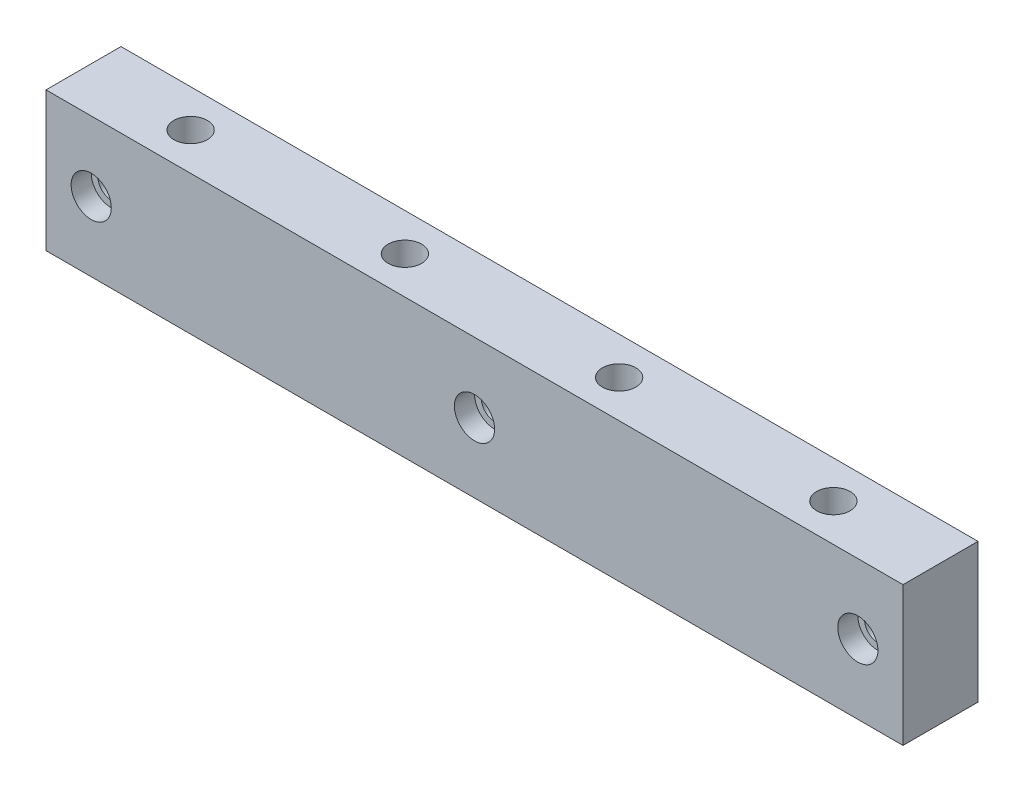
ISO-10303-21;
HEADER;
FILE_DESCRIPTION(('STEP AP214'),'2;1');
FILE_NAME('part.step','',(''),(''),'','','');
FILE_SCHEMA(('AUTOMOTIVE_DESIGN { 1 0 10303 214 1 1 1 1 }'));
ENDSEC;
DATA;
#1=APPLICATION_CONTEXT('core data for automotive mechanical design processes');
#2=APPLICATION_PROTOCOL_DEFINITION('international standard','automotive_design',2000,#1);
#3=PRODUCT_CONTEXT('',#1,'mechanical');
#4=PRODUCT('Part','Part','',(#3));
#5=PRODUCT_RELATED_PRODUCT_CATEGORY('part','',(#4));
#6=PRODUCT_DEFINITION_FORMATION('','',#4);
#7=PRODUCT_DEFINITION_CONTEXT('part definition',#1,'design');
#8=PRODUCT_DEFINITION('design','',#6,#7);
#9=PRODUCT_DEFINITION_SHAPE('','',#8);
#10=(LENGTH_UNIT() NAMED_UNIT(*) SI_UNIT(.MILLI.,.METRE.));
#11=(NAMED_UNIT(*) PLANE_ANGLE_UNIT() SI_UNIT($,.RADIAN.));
#12=(NAMED_UNIT(*) SI_UNIT($,.STERADIAN.) SOLID_ANGLE_UNIT());
#13=UNCERTAINTY_MEASURE_WITH_UNIT(LENGTH_MEASURE(1.E-05),#10,'distance_accuracy_value','');
#14=(GEOMETRIC_REPRESENTATION_CONTEXT(3) GLOBAL_UNCERTAINTY_ASSIGNED_CONTEXT((#13)) GLOBAL_UNIT_ASSIGNED_CONTEXT((#10,
#11,#12)) REPRESENTATION_CONTEXT('',''));
#15=CARTESIAN_POINT('',(0.,0.,0.));
#16=DIRECTION('',(0.,0.,1.));
#17=DIRECTION('',(1.,0.,0.));
#18=AXIS2_PLACEMENT_3D('',#15,#16,#17);
#19=CARTESIAN_POINT('',(-90.884375,-16.51,-26.7602561210691));
#20=DIRECTION('',(0.,0.,1.));
#21=DIRECTION('',(1.,0.,0.));
#22=AXIS2_PLACEMENT_3D('',#19,#20,#21);
#23=CYLINDRICAL_SURFACE('',#22,3.175);
#24=CARTESIAN_POINT('',(-90.884375,-16.51,-17.78));
#25=DIRECTION('',(0.,0.,-1.));
#26=DIRECTION('',(-1.,0.,0.));
#27=AXIS2_PLACEMENT_3D('',#24,#25,#26);
#28=CIRCLE('',#27,3.175);
#29=CARTESIAN_POINT('',(-94.059375,-16.51,-17.78));
#30=VERTEX_POINT('',#29);
#31=EDGE_CURVE('E125',#30,#30,#28,.F.);
#32=ORIENTED_EDGE('',*,*,#31,.F.);
#33=EDGE_LOOP('',(#32));
#34=FACE_BOUND('',#33,.T.);
#35=CARTESIAN_POINT('',(-90.884375,-16.51,-4.7752));
#36=DIRECTION('',(0.,0.,1.));
#37=DIRECTION('',(1.,0.,0.));
#38=AXIS2_PLACEMENT_3D('',#35,#36,#37);
#39=CIRCLE('',#38,3.175);
#40=CARTESIAN_POINT('',(-87.709375,-16.51,-4.7752));
#41=VERTEX_POINT('',#40);
#42=EDGE_CURVE('E42',#41,#41,#39,.F.);
#43=ORIENTED_EDGE('',*,*,#42,.F.);
#44=EDGE_LOOP('',(#43));
#45=FACE_BOUND('',#44,.T.);
#46=ADVANCED_FACE('F38',(#34,#45),#23,.F.);
#47=CARTESIAN_POINT('',(0.,-16.51,-26.7602561210691));
#48=DIRECTION('',(0.,0.,1.));
#49=DIRECTION('',(1.,0.,0.));
#50=AXIS2_PLACEMENT_3D('',#47,#48,#49);
#51=CYLINDRICAL_SURFACE('',#50,3.175);
#52=CARTESIAN_POINT('',(0.,-16.51,-17.78));
#53=DIRECTION('',(0.,0.,-1.));
#54=DIRECTION('',(-1.,0.,0.));
#55=AXIS2_PLACEMENT_3D('',#52,#53,#54);
#56=CIRCLE('',#55,3.175);
#57=CARTESIAN_POINT('',(-3.175,-16.51,-17.78));
#58=VERTEX_POINT('',#57);
#59=EDGE_CURVE('E129',#58,#58,#56,.F.);
#60=ORIENTED_EDGE('',*,*,#59,.F.);
#61=EDGE_LOOP('',(#60));
#62=FACE_BOUND('',#61,.T.);
#63=CARTESIAN_POINT('',(0.,-16.51,-4.7752));
#64=DIRECTION('',(0.,0.,1.));
#65=DIRECTION('',(1.,0.,0.));
#66=AXIS2_PLACEMENT_3D('',#63,#64,#65);
#67=CIRCLE('',#66,3.175);
#68=CARTESIAN_POINT('',(3.175,-16.51,-4.7752));
#69=VERTEX_POINT('',#68);
#70=EDGE_CURVE('E119',#69,#69,#67,.F.);
#71=ORIENTED_EDGE('',*,*,#70,.F.);
#72=EDGE_LOOP('',(#71));
#73=FACE_BOUND('',#72,.T.);
#74=ADVANCED_FACE('F181',(#62,#73),#51,.F.);
#75=CARTESIAN_POINT('',(90.884375,-16.51,-26.7602561210691));
#76=DIRECTION('',(0.,0.,1.));
#77=DIRECTION('',(1.,0.,0.));
#78=AXIS2_PLACEMENT_3D('',#75,#76,#77);
#79=CYLINDRICAL_SURFACE('',#78,3.175);
#80=CARTESIAN_POINT('',(90.884375,-16.51,-17.78));
#81=DIRECTION('',(0.,0.,-1.));
#82=DIRECTION('',(-1.,0.,0.));
#83=AXIS2_PLACEMENT_3D('',#80,#81,#82);
#84=CIRCLE('',#83,3.175);
#85=CARTESIAN_POINT('',(87.709375,-16.51,-17.78));
#86=VERTEX_POINT('',#85);
#87=EDGE_CURVE('E134',#86,#86,#84,.F.);
#88=ORIENTED_EDGE('',*,*,#87,.F.);
#89=EDGE_LOOP('',(#88));
#90=FACE_BOUND('',#89,.T.);
#91=CARTESIAN_POINT('',(90.884375,-16.51,-4.7752));
#92=DIRECTION('',(0.,0.,1.));
#93=DIRECTION('',(1.,0.,0.));
#94=AXIS2_PLACEMENT_3D('',#91,#92,#93);
#95=CIRCLE('',#94,3.175);
#96=CARTESIAN_POINT('',(94.059375,-16.51,-4.7752));
#97=VERTEX_POINT('',#96);
#98=EDGE_CURVE('E117',#97,#97,#95,.F.);
#99=ORIENTED_EDGE('',*,*,#98,.F.);
#100=EDGE_LOOP('',(#99));
#101=FACE_BOUND('',#100,.T.);
#102=ADVANCED_FACE('F177',(#90,#101),#79,.F.);
#103=CARTESIAN_POINT('',(-101.6,-33.02,-17.78));
#104=DIRECTION('',(-1.,0.,0.));
#105=DIRECTION('',(0.,0.,1.));
#106=AXIS2_PLACEMENT_3D('',#103,#104,#105);
#107=PLANE('',#106);
#108=DIRECTION('',(0.,0.,1.));
#109=VECTOR('',#108,1.);
#110=CARTESIAN_POINT('',(-101.6,0.,-17.78));
#111=LINE('',#110,#109);
#112=CARTESIAN_POINT('',(-101.6,0.,-17.78));
#113=VERTEX_POINT('',#112);
#114=CARTESIAN_POINT('',(-101.6,0.,0.));
#115=VERTEX_POINT('',#114);
#116=EDGE_CURVE('E106',#113,#115,#111,.T.);
#117=ORIENTED_EDGE('',*,*,#116,.F.);
#118=DIRECTION('',(0.,1.,0.));
#119=VECTOR('',#118,1.);
#120=CARTESIAN_POINT('',(-101.6,-33.02,-17.78));
#121=LINE('',#120,#119);
#122=CARTESIAN_POINT('',(-101.6,-33.02,-17.78));
#123=VERTEX_POINT('',#122);
#124=EDGE_CURVE('E11',#123,#113,#121,.T.);
#125=ORIENTED_EDGE('',*,*,#124,.F.);
#126=DIRECTION('',(0.,0.,1.));
#127=VECTOR('',#126,1.);
#128=CARTESIAN_POINT('',(-101.6,-33.02,-17.78));
#129=LINE('',#128,#127);
#130=CARTESIAN_POINT('',(-101.6,-33.02,0.));
#131=VERTEX_POINT('',#130);
#132=EDGE_CURVE('E99',#123,#131,#129,.T.);
#133=ORIENTED_EDGE('',*,*,#132,.T.);
#134=DIRECTION('',(0.,1.,0.));
#135=VECTOR('',#134,1.);
#136=CARTESIAN_POINT('',(-101.6,-33.02,0.));
#137=LINE('',#136,#135);
#138=EDGE_CURVE('E82',#131,#115,#137,.T.);
#139=ORIENTED_EDGE('',*,*,#138,.T.);
#140=EDGE_LOOP('',(#117,#125,#133,#139));
#141=FACE_BOUND('',#140,.T.);
#142=ADVANCED_FACE('F40',(#141),#107,.T.);
#143=CARTESIAN_POINT('',(101.6,-33.02,-17.78));
#144=DIRECTION('',(0.,0.,-1.));
#145=DIRECTION('',(-1.,0.,0.));
#146=AXIS2_PLACEMENT_3D('',#143,#144,#145);
#147=PLANE('',#146);
#148=ORIENTED_EDGE('',*,*,#87,.T.);
#149=EDGE_LOOP('',(#148));
#150=FACE_BOUND('',#149,.T.);
#151=ORIENTED_EDGE('',*,*,#59,.T.);
#152=EDGE_LOOP('',(#151));
#153=FACE_BOUND('',#152,.T.);
#154=ORIENTED_EDGE('',*,*,#31,.T.);
#155=EDGE_LOOP('',(#154));
#156=FACE_BOUND('',#155,.T.);
#157=DIRECTION('',(-1.,0.,0.));
#158=VECTOR('',#157,1.);
#159=CARTESIAN_POINT('',(101.6,0.,-17.78));
#160=LINE('',#159,#158);
#161=CARTESIAN_POINT('',(101.6,0.,-17.78));
#162=VERTEX_POINT('',#161);
#163=EDGE_CURVE('E101',#162,#113,#160,.T.);
#164=ORIENTED_EDGE('',*,*,#163,.F.);
#165=DIRECTION('',(0.,1.,0.));
#166=VECTOR('',#165,1.);
#167=CARTESIAN_POINT('',(101.6,-33.02,-17.78));
#168=LINE('',#167,#166);
#169=CARTESIAN_POINT('',(101.6,-33.02,-17.78));
#170=VERTEX_POINT('',#169);
#171=EDGE_CURVE('E48',#170,#162,#168,.T.);
#172=ORIENTED_EDGE('',*,*,#171,.F.);
#173=DIRECTION('',(-1.,0.,0.));
#174=VECTOR('',#173,1.);
#175=CARTESIAN_POINT('',(101.6,-33.02,-17.78));
#176=LINE('',#175,#174);
#177=EDGE_CURVE('E96',#170,#123,#176,.T.);
#178=ORIENTED_EDGE('',*,*,#177,.T.);
#179=ORIENTED_EDGE('',*,*,#124,.T.);
#180=EDGE_LOOP('',(#164,#172,#178,#179));
#181=FACE_BOUND('',#180,.T.);
#182=ADVANCED_FACE('F168',(#150,#153,#156,#181),#147,.T.);
#183=CARTESIAN_POINT('',(101.6,-33.02,-17.78));
#184=DIRECTION('',(1.,0.,0.));
#185=DIRECTION('',(0.,0.,-1.));
#186=AXIS2_PLACEMENT_3D('',#183,#184,#185);
#187=PLANE('',#186);
#188=DIRECTION('',(0.,0.,-1.));
#189=VECTOR('',#188,1.);
#190=CARTESIAN_POINT('',(101.6,0.,-17.78));
#191=LINE('',#190,#189);
#192=CARTESIAN_POINT('',(101.6,0.,0.));
#193=VERTEX_POINT('',#192);
#194=EDGE_CURVE('E90',#193,#162,#191,.T.);
#195=ORIENTED_EDGE('',*,*,#194,.F.);
#196=DIRECTION('',(0.,1.,0.));
#197=VECTOR('',#196,1.);
#198=CARTESIAN_POINT('',(101.6,-33.02,0.));
#199=LINE('',#198,#197);
#200=CARTESIAN_POINT('',(101.6,-33.02,0.));
#201=VERTEX_POINT('',#200);
#202=EDGE_CURVE('E85',#201,#193,#199,.T.);
#203=ORIENTED_EDGE('',*,*,#202,.F.);
#204=DIRECTION('',(0.,0.,-1.));
#205=VECTOR('',#204,1.);
#206=CARTESIAN_POINT('',(101.6,-33.02,-17.78));
#207=LINE('',#206,#205);
#208=EDGE_CURVE('E88',#201,#170,#207,.T.);
#209=ORIENTED_EDGE('',*,*,#208,.T.);
#210=ORIENTED_EDGE('',*,*,#171,.T.);
#211=EDGE_LOOP('',(#195,#203,#209,#210));
#212=FACE_BOUND('',#211,.T.);
#213=ADVANCED_FACE('F87',(#212),#187,.T.);
#214=CARTESIAN_POINT('',(101.6,-33.02,0.));
#215=DIRECTION('',(0.,0.,1.));
#216=DIRECTION('',(1.,0.,0.));
#217=AXIS2_PLACEMENT_3D('',#214,#215,#216);
#218=PLANE('',#217);
#219=CARTESIAN_POINT('',(90.884375,-16.51,0.));
#220=DIRECTION('',(0.,0.,1.));
#221=DIRECTION('',(1.,0.,0.));
#222=AXIS2_PLACEMENT_3D('',#219,#220,#221);
#223=CIRCLE('',#222,4.76250000000001);
#224=CARTESIAN_POINT('',(95.646875,-16.51,0.));
#225=VERTEX_POINT('',#224);
#226=EDGE_CURVE('E234',#225,#225,#223,.T.);
#227=ORIENTED_EDGE('',*,*,#226,.F.);
#228=EDGE_LOOP('',(#227));
#229=FACE_BOUND('',#228,.T.);
#230=CARTESIAN_POINT('',(0.,-16.51,0.));
#231=DIRECTION('',(0.,0.,1.));
#232=DIRECTION('',(1.,0.,0.));
#233=AXIS2_PLACEMENT_3D('',#230,#231,#232);
#234=CIRCLE('',#233,4.7625);
#235=CARTESIAN_POINT('',(4.7625,-16.51,0.));
#236=VERTEX_POINT('',#235);
#237=EDGE_CURVE('E238',#236,#236,#234,.T.);
#238=ORIENTED_EDGE('',*,*,#237,.F.);
#239=EDGE_LOOP('',(#238));
#240=FACE_BOUND('',#239,.T.);
#241=CARTESIAN_POINT('',(-90.884375,-16.51,0.));
#242=DIRECTION('',(0.,0.,1.));
#243=DIRECTION('',(1.,0.,0.));
#244=AXIS2_PLACEMENT_3D('',#241,#242,#243);
#245=CIRCLE('',#244,4.7625);
#246=CARTESIAN_POINT('',(-86.121875,-16.51,0.));
#247=VERTEX_POINT('',#246);
#248=EDGE_CURVE('E241',#247,#247,#245,.T.);
#249=ORIENTED_EDGE('',*,*,#248,.F.);
#250=EDGE_LOOP('',(#249));
#251=FACE_BOUND('',#250,.T.);
#252=DIRECTION('',(1.,0.,0.));
#253=VECTOR('',#252,1.);
#254=CARTESIAN_POINT('',(101.6,0.,0.));
#255=LINE('',#254,#253);
#256=EDGE_CURVE('E109',#115,#193,#255,.T.);
#257=ORIENTED_EDGE('',*,*,#256,.F.);
#258=ORIENTED_EDGE('',*,*,#138,.F.);
#259=DIRECTION('',(1.,0.,0.));
#260=VECTOR('',#259,1.);
#261=CARTESIAN_POINT('',(101.6,-33.02,0.));
#262=LINE('',#261,#260);
#263=EDGE_CURVE('E95',#131,#201,#262,.T.);
#264=ORIENTED_EDGE('',*,*,#263,.T.);
#265=ORIENTED_EDGE('',*,*,#202,.T.);
#266=EDGE_LOOP('',(#257,#258,#264,#265));
#267=FACE_BOUND('',#266,.T.);
#268=ADVANCED_FACE('F98',(#229,#240,#251,#267),#218,.T.);
#269=CARTESIAN_POINT('',(0.,-33.02,0.));
#270=DIRECTION('',(0.,-1.,0.));
#271=DIRECTION('',(0.,0.,-1.));
#272=AXIS2_PLACEMENT_3D('',#269,#270,#271);
#273=PLANE('',#272);
#274=CARTESIAN_POINT('',(-76.2,-33.02,-8.88999999999998));
#275=DIRECTION('',(0.,1.,0.));
#276=DIRECTION('',(0.,0.,1.));
#277=AXIS2_PLACEMENT_3D('',#274,#275,#276);
#278=CIRCLE('',#277,3.96875);
#279=CARTESIAN_POINT('',(-76.2,-33.02,-4.92124999999998));
#280=VERTEX_POINT('',#279);
#281=EDGE_CURVE('E138',#280,#280,#278,.T.);
#282=ORIENTED_EDGE('',*,*,#281,.T.);
#283=EDGE_LOOP('',(#282));
#284=FACE_BOUND('',#283,.T.);
#285=CARTESIAN_POINT('',(-25.4,-33.02,-8.88999999999998));
#286=DIRECTION('',(0.,1.,0.));
#287=DIRECTION('',(0.,0.,1.));
#288=AXIS2_PLACEMENT_3D('',#285,#286,#287);
#289=CIRCLE('',#288,3.96874999999999);
#290=CARTESIAN_POINT('',(-25.4,-33.02,-4.92124999999999));
#291=VERTEX_POINT('',#290);
#292=EDGE_CURVE('E145',#291,#291,#289,.T.);
#293=ORIENTED_EDGE('',*,*,#292,.T.);
#294=EDGE_LOOP('',(#293));
#295=FACE_BOUND('',#294,.T.);
#296=CARTESIAN_POINT('',(25.4,-33.02,-8.88999999999999));
#297=DIRECTION('',(0.,1.,0.));
#298=DIRECTION('',(0.,0.,1.));
#299=AXIS2_PLACEMENT_3D('',#296,#297,#298);
#300=CIRCLE('',#299,3.96874999999999);
#301=CARTESIAN_POINT('',(25.4,-33.02,-4.92125));
#302=VERTEX_POINT('',#301);
#303=EDGE_CURVE('E151',#302,#302,#300,.T.);
#304=ORIENTED_EDGE('',*,*,#303,.T.);
#305=EDGE_LOOP('',(#304));
#306=FACE_BOUND('',#305,.T.);
#307=CARTESIAN_POINT('',(76.2,-33.02,-8.88999999999999));
#308=DIRECTION('',(0.,1.,0.));
#309=DIRECTION('',(0.,0.,1.));
#310=AXIS2_PLACEMENT_3D('',#307,#308,#309);
#311=CIRCLE('',#310,3.96875);
#312=CARTESIAN_POINT('',(76.2,-33.02,-4.92124999999999));
#313=VERTEX_POINT('',#312);
#314=EDGE_CURVE('E110',#313,#313,#311,.T.);
#315=ORIENTED_EDGE('',*,*,#314,.T.);
#316=EDGE_LOOP('',(#315));
#317=FACE_BOUND('',#316,.T.);
#318=ORIENTED_EDGE('',*,*,#132,.F.);
#319=ORIENTED_EDGE('',*,*,#177,.F.);
#320=ORIENTED_EDGE('',*,*,#208,.F.);
#321=ORIENTED_EDGE('',*,*,#263,.F.);
#322=EDGE_LOOP('',(#318,#319,#320,#321));
#323=FACE_BOUND('',#322,.T.);
#324=ADVANCED_FACE('F94',(#284,#295,#306,#317,#323),#273,.T.);
#325=CARTESIAN_POINT('',(0.,0.,0.));
#326=DIRECTION('',(0.,-1.,0.));
#327=DIRECTION('',(0.,0.,-1.));
#328=AXIS2_PLACEMENT_3D('',#325,#326,#327);
#329=PLANE('',#328);
#330=CARTESIAN_POINT('',(-76.2,0.,-8.88999999999998));
#331=DIRECTION('',(0.,1.,0.));
#332=DIRECTION('',(0.,0.,1.));
#333=AXIS2_PLACEMENT_3D('',#330,#331,#332);
#334=CIRCLE('',#333,3.96875);
#335=CARTESIAN_POINT('',(-76.2,0.,-4.92124999999998));
#336=VERTEX_POINT('',#335);
#337=EDGE_CURVE('E142',#336,#336,#334,.T.);
#338=ORIENTED_EDGE('',*,*,#337,.F.);
#339=EDGE_LOOP('',(#338));
#340=FACE_BOUND('',#339,.T.);
#341=CARTESIAN_POINT('',(-25.4,0.,-8.88999999999998));
#342=DIRECTION('',(0.,1.,0.));
#343=DIRECTION('',(0.,0.,1.));
#344=AXIS2_PLACEMENT_3D('',#341,#342,#343);
#345=CIRCLE('',#344,3.96874999999999);
#346=CARTESIAN_POINT('',(-25.4,0.,-4.92124999999999));
#347=VERTEX_POINT('',#346);
#348=EDGE_CURVE('E141',#347,#347,#345,.T.);
#349=ORIENTED_EDGE('',*,*,#348,.F.);
#350=EDGE_LOOP('',(#349));
#351=FACE_BOUND('',#350,.T.);
#352=CARTESIAN_POINT('',(25.4,0.,-8.88999999999999));
#353=DIRECTION('',(0.,1.,0.));
#354=DIRECTION('',(0.,0.,1.));
#355=AXIS2_PLACEMENT_3D('',#352,#353,#354);
#356=CIRCLE('',#355,3.96874999999999);
#357=CARTESIAN_POINT('',(25.4,0.,-4.92125));
#358=VERTEX_POINT('',#357);
#359=EDGE_CURVE('E148',#358,#358,#356,.T.);
#360=ORIENTED_EDGE('',*,*,#359,.F.);
#361=EDGE_LOOP('',(#360));
#362=FACE_BOUND('',#361,.T.);
#363=CARTESIAN_POINT('',(76.2,0.,-8.88999999999999));
#364=DIRECTION('',(0.,1.,0.));
#365=DIRECTION('',(0.,0.,1.));
#366=AXIS2_PLACEMENT_3D('',#363,#364,#365);
#367=CIRCLE('',#366,3.96875);
#368=CARTESIAN_POINT('',(76.2,0.,-4.92124999999999));
#369=VERTEX_POINT('',#368);
#370=EDGE_CURVE('E154',#369,#369,#367,.T.);
#371=ORIENTED_EDGE('',*,*,#370,.F.);
#372=EDGE_LOOP('',(#371));
#373=FACE_BOUND('',#372,.T.);
#374=ORIENTED_EDGE('',*,*,#116,.T.);
#375=ORIENTED_EDGE('',*,*,#256,.T.);
#376=ORIENTED_EDGE('',*,*,#194,.T.);
#377=ORIENTED_EDGE('',*,*,#163,.T.);
#378=EDGE_LOOP('',(#374,#375,#376,#377));
#379=FACE_BOUND('',#378,.T.);
#380=ADVANCED_FACE('F163',(#340,#351,#362,#373,#379),#329,.F.);
#381=CARTESIAN_POINT('',(76.2,-33.02,-8.88999999999999));
#382=DIRECTION('',(0.,1.,0.));
#383=DIRECTION('',(0.,0.,1.));
#384=AXIS2_PLACEMENT_3D('',#381,#382,#383);
#385=CYLINDRICAL_SURFACE('',#384,3.96875);
#386=ORIENTED_EDGE('',*,*,#314,.F.);
#387=EDGE_LOOP('',(#386));
#388=FACE_BOUND('',#387,.T.);
#389=ORIENTED_EDGE('',*,*,#370,.T.);
#390=EDGE_LOOP('',(#389));
#391=FACE_BOUND('',#390,.T.);
#392=ADVANCED_FACE('F161',(#388,#391),#385,.F.);
#393=CARTESIAN_POINT('',(25.4,-33.02,-8.88999999999999));
#394=DIRECTION('',(0.,1.,0.));
#395=DIRECTION('',(0.,0.,1.));
#396=AXIS2_PLACEMENT_3D('',#393,#394,#395);
#397=CYLINDRICAL_SURFACE('',#396,3.96874999999999);
#398=ORIENTED_EDGE('',*,*,#303,.F.);
#399=EDGE_LOOP('',(#398));
#400=FACE_BOUND('',#399,.T.);
#401=ORIENTED_EDGE('',*,*,#359,.T.);
#402=EDGE_LOOP('',(#401));
#403=FACE_BOUND('',#402,.T.);
#404=ADVANCED_FACE('F200',(#400,#403),#397,.F.);
#405=CARTESIAN_POINT('',(-25.4,-33.02,-8.88999999999998));
#406=DIRECTION('',(0.,1.,0.));
#407=DIRECTION('',(0.,0.,1.));
#408=AXIS2_PLACEMENT_3D('',#405,#406,#407);
#409=CYLINDRICAL_SURFACE('',#408,3.96874999999999);
#410=ORIENTED_EDGE('',*,*,#292,.F.);
#411=EDGE_LOOP('',(#410));
#412=FACE_BOUND('',#411,.T.);
#413=ORIENTED_EDGE('',*,*,#348,.T.);
#414=EDGE_LOOP('',(#413));
#415=FACE_BOUND('',#414,.T.);
#416=ADVANCED_FACE('F196',(#412,#415),#409,.F.);
#417=CARTESIAN_POINT('',(-76.2,-33.02,-8.88999999999998));
#418=DIRECTION('',(0.,1.,0.));
#419=DIRECTION('',(0.,0.,1.));
#420=AXIS2_PLACEMENT_3D('',#417,#418,#419);
#421=CYLINDRICAL_SURFACE('',#420,3.96875);
#422=ORIENTED_EDGE('',*,*,#281,.F.);
#423=EDGE_LOOP('',(#422));
#424=FACE_BOUND('',#423,.T.);
#425=ORIENTED_EDGE('',*,*,#337,.T.);
#426=EDGE_LOOP('',(#425));
#427=FACE_BOUND('',#426,.T.);
#428=ADVANCED_FACE('F192',(#424,#427),#421,.F.);
#429=CARTESIAN_POINT('',(90.884375,-16.51,-4.7752));
#430=DIRECTION('',(0.,0.,1.));
#431=DIRECTION('',(1.,0.,0.));
#432=AXIS2_PLACEMENT_3D('',#429,#430,#431);
#433=PLANE('',#432);
#434=CARTESIAN_POINT('',(90.884375,-16.51,-4.7752));
#435=DIRECTION('',(0.,0.,1.));
#436=DIRECTION('',(1.,0.,0.));
#437=AXIS2_PLACEMENT_3D('',#434,#435,#436);
#438=CIRCLE('',#437,4.76250000000001);
#439=CARTESIAN_POINT('',(95.646875,-16.51,-4.7752));
#440=VERTEX_POINT('',#439);
#441=EDGE_CURVE('E120',#440,#440,#438,.T.);
#442=ORIENTED_EDGE('',*,*,#441,.T.);
#443=EDGE_LOOP('',(#442));
#444=FACE_BOUND('',#443,.T.);
#445=ORIENTED_EDGE('',*,*,#98,.T.);
#446=EDGE_LOOP('',(#445));
#447=FACE_BOUND('',#446,.T.);
#448=ADVANCED_FACE('F195',(#444,#447),#433,.T.);
#449=CARTESIAN_POINT('',(90.884375,-16.51,-4.7752));
#450=DIRECTION('',(0.,0.,1.));
#451=DIRECTION('',(1.,0.,0.));
#452=AXIS2_PLACEMENT_3D('',#449,#450,#451);
#453=CYLINDRICAL_SURFACE('',#452,4.76250000000001);
#454=ORIENTED_EDGE('',*,*,#441,.F.);
#455=EDGE_LOOP('',(#454));
#456=FACE_BOUND('',#455,.T.);
#457=ORIENTED_EDGE('',*,*,#226,.T.);
#458=EDGE_LOOP('',(#457));
#459=FACE_BOUND('',#458,.T.);
#460=ADVANCED_FACE('F255',(#456,#459),#453,.F.);
#461=CARTESIAN_POINT('',(0.,-16.51,-4.7752));
#462=DIRECTION('',(0.,0.,1.));
#463=DIRECTION('',(1.,0.,0.));
#464=AXIS2_PLACEMENT_3D('',#461,#462,#463);
#465=PLANE('',#464);
#466=CARTESIAN_POINT('',(0.,-16.51,-4.7752));
#467=DIRECTION('',(0.,0.,1.));
#468=DIRECTION('',(1.,0.,0.));
#469=AXIS2_PLACEMENT_3D('',#466,#467,#468);
#470=CIRCLE('',#469,4.7625);
#471=CARTESIAN_POINT('',(4.7625,-16.51,-4.7752));
#472=VERTEX_POINT('',#471);
#473=EDGE_CURVE('E390',#472,#472,#470,.T.);
#474=ORIENTED_EDGE('',*,*,#473,.T.);
#475=EDGE_LOOP('',(#474));
#476=FACE_BOUND('',#475,.T.);
#477=ORIENTED_EDGE('',*,*,#70,.T.);
#478=EDGE_LOOP('',(#477));
#479=FACE_BOUND('',#478,.T.);
#480=ADVANCED_FACE('F261',(#476,#479),#465,.T.);
#481=CARTESIAN_POINT('',(0.,-16.51,-4.7752));
#482=DIRECTION('',(0.,0.,1.));
#483=DIRECTION('',(1.,0.,0.));
#484=AXIS2_PLACEMENT_3D('',#481,#482,#483);
#485=CYLINDRICAL_SURFACE('',#484,4.7625);
#486=ORIENTED_EDGE('',*,*,#473,.F.);
#487=EDGE_LOOP('',(#486));
#488=FACE_BOUND('',#487,.T.);
#489=ORIENTED_EDGE('',*,*,#237,.T.);
#490=EDGE_LOOP('',(#489));
#491=FACE_BOUND('',#490,.T.);
#492=ADVANCED_FACE('F268',(#488,#491),#485,.F.);
#493=CARTESIAN_POINT('',(-90.884375,-16.51,-4.7752));
#494=DIRECTION('',(0.,0.,1.));
#495=DIRECTION('',(1.,0.,0.));
#496=AXIS2_PLACEMENT_3D('',#493,#494,#495);
#497=PLANE('',#496);
#498=CARTESIAN_POINT('',(-90.884375,-16.51,-4.7752));
#499=DIRECTION('',(0.,0.,1.));
#500=DIRECTION('',(1.,0.,0.));
#501=AXIS2_PLACEMENT_3D('',#498,#499,#500);
#502=CIRCLE('',#501,4.7625);
#503=CARTESIAN_POINT('',(-86.121875,-16.51,-4.7752));
#504=VERTEX_POINT('',#503);
#505=EDGE_CURVE('E243',#504,#504,#502,.T.);
#506=ORIENTED_EDGE('',*,*,#505,.T.);
#507=EDGE_LOOP('',(#506));
#508=FACE_BOUND('',#507,.T.);
#509=ORIENTED_EDGE('',*,*,#42,.T.);
#510=EDGE_LOOP('',(#509));
#511=FACE_BOUND('',#510,.T.);
#512=ADVANCED_FACE('F272',(#508,#511),#497,.T.);
#513=CARTESIAN_POINT('',(-90.884375,-16.51,-4.7752));
#514=DIRECTION('',(0.,0.,1.));
#515=DIRECTION('',(1.,0.,0.));
#516=AXIS2_PLACEMENT_3D('',#513,#514,#515);
#517=CYLINDRICAL_SURFACE('',#516,4.7625);
#518=ORIENTED_EDGE('',*,*,#505,.F.);
#519=EDGE_LOOP('',(#518));
#520=FACE_BOUND('',#519,.T.);
#521=ORIENTED_EDGE('',*,*,#248,.T.);
#522=EDGE_LOOP('',(#521));
#523=FACE_BOUND('',#522,.T.);
#524=ADVANCED_FACE('F276',(#520,#523),#517,.F.);
#525=CLOSED_SHELL('',(#46,#74,#102,#142,#182,#213,#268,#324,#380,#392,#404,#416,#428,#448,#460,
#480,#492,#512,#524));
#526=MANIFOLD_SOLID_BREP('B2',#525);
#527=ADVANCED_BREP_SHAPE_REPRESENTATION('',(#18,#526),#14);
#528=SHAPE_DEFINITION_REPRESENTATION(#9,#527);
ENDSEC;
END-ISO-10303-21;
